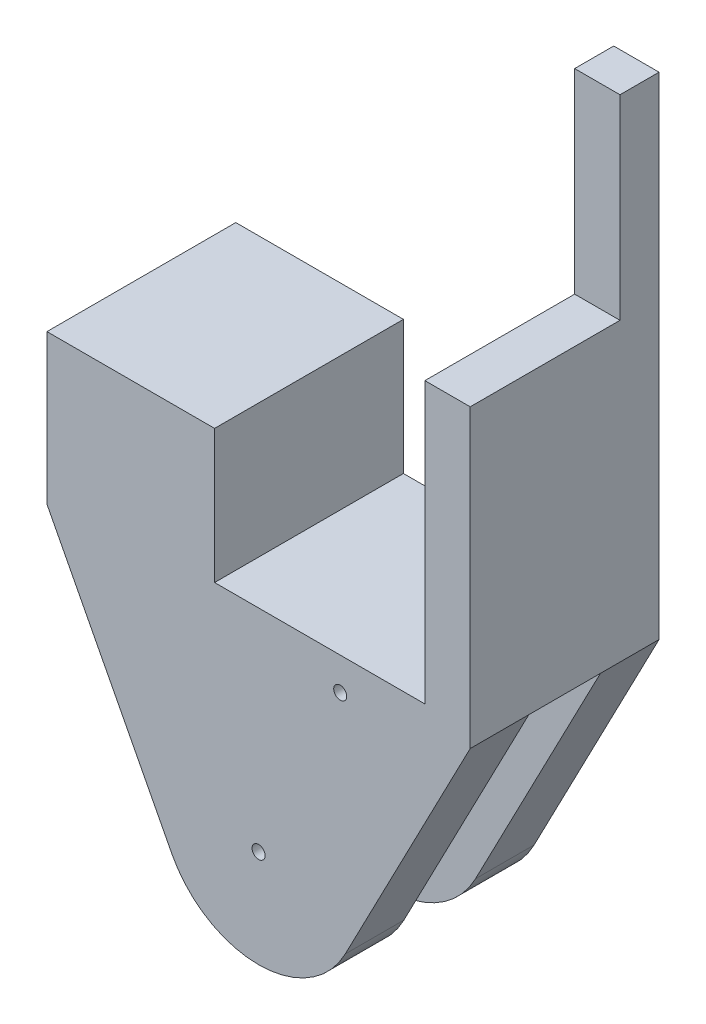
ISO-10303-21;
HEADER;
FILE_DESCRIPTION(('STEP AP214'),'2;1');
FILE_NAME('part.step','',(''),(''),'','','');
FILE_SCHEMA(('AUTOMOTIVE_DESIGN { 1 0 10303 214 1 1 1 1 }'));
ENDSEC;
DATA;
#1=APPLICATION_CONTEXT('core data for automotive mechanical design processes');
#2=APPLICATION_PROTOCOL_DEFINITION('international standard','automotive_design',2000,#1);
#3=PRODUCT_CONTEXT('',#1,'mechanical');
#4=PRODUCT('Part','Part','',(#3));
#5=PRODUCT_RELATED_PRODUCT_CATEGORY('part','',(#4));
#6=PRODUCT_DEFINITION_FORMATION('','',#4);
#7=PRODUCT_DEFINITION_CONTEXT('part definition',#1,'design');
#8=PRODUCT_DEFINITION('design','',#6,#7);
#9=PRODUCT_DEFINITION_SHAPE('','',#8);
#10=(LENGTH_UNIT() NAMED_UNIT(*) SI_UNIT(.MILLI.,.METRE.));
#11=(NAMED_UNIT(*) PLANE_ANGLE_UNIT() SI_UNIT($,.RADIAN.));
#12=(NAMED_UNIT(*) SI_UNIT($,.STERADIAN.) SOLID_ANGLE_UNIT());
#13=UNCERTAINTY_MEASURE_WITH_UNIT(LENGTH_MEASURE(1.E-05),#10,'distance_accuracy_value','');
#14=(GEOMETRIC_REPRESENTATION_CONTEXT(3) GLOBAL_UNCERTAINTY_ASSIGNED_CONTEXT((#13)) GLOBAL_UNIT_ASSIGNED_CONTEXT((#10,
#11,#12)) REPRESENTATION_CONTEXT('',''));
#15=CARTESIAN_POINT('',(0.,0.,0.));
#16=DIRECTION('',(0.,0.,1.));
#17=DIRECTION('',(1.,0.,0.));
#18=AXIS2_PLACEMENT_3D('',#15,#16,#17);
#19=CARTESIAN_POINT('',(-32.5,32.4499999999811,39.9999999999906));
#20=DIRECTION('',(0.,-1.,-7.37656463689618E-13));
#21=DIRECTION('',(-1.,0.,0.));
#22=AXIS2_PLACEMENT_3D('',#19,#20,#21);
#23=PLANE('',#22);
#24=DIRECTION('',(0.,7.37656463689618E-13,-1.));
#25=VECTOR('',#24,1.);
#26=CARTESIAN_POINT('',(-6.75628302707423,32.4499999999892,28.9999999999906));
#27=LINE('',#26,#25);
#28=CARTESIAN_POINT('',(-6.75628302707423,32.4499999999892,28.9999999999906));
#29=VERTEX_POINT('',#28);
#30=CARTESIAN_POINT('',(-6.75628302707423,32.4500000000106,-9.45077349712165E-12));
#31=VERTEX_POINT('',#30);
#32=EDGE_CURVE('E338',#29,#31,#27,.T.);
#33=ORIENTED_EDGE('',*,*,#32,.F.);
#34=DIRECTION('',(1.,0.,0.));
#35=VECTOR('',#34,1.);
#36=CARTESIAN_POINT('',(-32.5,32.4499999999892,28.9999999999906));
#37=LINE('',#36,#35);
#38=CARTESIAN_POINT('',(25.5375870433585,32.4499999999892,28.9999999999906));
#39=VERTEX_POINT('',#38);
#40=EDGE_CURVE('E255',#29,#39,#37,.T.);
#41=ORIENTED_EDGE('',*,*,#40,.T.);
#42=DIRECTION('',(0.,-7.37656463689618E-13,1.));
#43=VECTOR('',#42,1.);
#44=CARTESIAN_POINT('',(25.5375870433585,32.4499999999892,28.9999999999906));
#45=LINE('',#44,#43);
#46=CARTESIAN_POINT('',(25.5375870433585,32.4500000000106,-9.45077349712165E-12));
#47=VERTEX_POINT('',#46);
#48=EDGE_CURVE('E212',#47,#39,#45,.T.);
#49=ORIENTED_EDGE('',*,*,#48,.F.);
#50=DIRECTION('',(-1.,0.,0.));
#51=VECTOR('',#50,1.);
#52=CARTESIAN_POINT('',(-32.5,32.4500000000106,-9.45077349712165E-12));
#53=LINE('',#52,#51);
#54=EDGE_CURVE('E95',#47,#31,#53,.T.);
#55=ORIENTED_EDGE('',*,*,#54,.T.);
#56=EDGE_LOOP('',(#33,#41,#49,#55));
#57=FACE_BOUND('',#56,.T.);
#58=ADVANCED_FACE('F73',(#57),#23,.F.);
#59=CARTESIAN_POINT('',(0.,1.35134958778593E-11,-4.00000000003339));
#60=DIRECTION('',(0.,-7.37656463689618E-13,1.));
#61=DIRECTION('',(0.,-1.,-7.37656463689618E-13));
#62=AXIS2_PLACEMENT_3D('',#59,#60,#61);
#63=CYLINDRICAL_SURFACE('',#62,0.999999999999998);
#64=CARTESIAN_POINT('',(0.,3.92394450265954E-12,8.99999999996662));
#65=DIRECTION('',(0.,7.37656463689618E-13,-1.));
#66=DIRECTION('',(0.,1.,7.37656463689618E-13));
#67=AXIS2_PLACEMENT_3D('',#64,#65,#66);
#68=CIRCLE('',#67,0.999999999999998);
#69=CARTESIAN_POINT('',(0.,1.00000000000392,8.99999999996736));
#70=VERTEX_POINT('',#69);
#71=EDGE_CURVE('E303',#70,#70,#68,.T.);
#72=ORIENTED_EDGE('',*,*,#71,.F.);
#73=EDGE_LOOP('',(#72));
#74=FACE_BOUND('',#73,.T.);
#75=CARTESIAN_POINT('',(0.,8.75341465977897E-12,2.44999999996662));
#76=DIRECTION('',(0.,7.37656463689618E-13,-1.));
#77=DIRECTION('',(0.,1.,7.37656463689618E-13));
#78=AXIS2_PLACEMENT_3D('',#75,#76,#77);
#79=CIRCLE('',#78,0.999999999999998);
#80=CARTESIAN_POINT('',(0.,1.00000000000875,2.44999999996736));
#81=VERTEX_POINT('',#80);
#82=EDGE_CURVE('E280',#81,#81,#79,.F.);
#83=ORIENTED_EDGE('',*,*,#82,.F.);
#84=EDGE_LOOP('',(#83));
#85=FACE_BOUND('',#84,.T.);
#86=ADVANCED_FACE('F418',(#74,#85),#63,.F.);
#87=CARTESIAN_POINT('',(-32.5,30.0000000000039,8.99999999998875));
#88=DIRECTION('',(0.,7.37656463689618E-13,-1.));
#89=DIRECTION('',(0.,1.,7.37656463689618E-13));
#90=AXIS2_PLACEMENT_3D('',#87,#88,#89);
#91=PLANE('',#90);
#92=CARTESIAN_POINT('',(12.5375870433585,27.4500000000039,8.99999999998687));
#93=DIRECTION('',(0.,7.37656463689618E-13,-1.));
#94=DIRECTION('',(0.,1.,7.37656463689618E-13));
#95=AXIS2_PLACEMENT_3D('',#92,#93,#94);
#96=CIRCLE('',#95,0.999999999999998);
#97=CARTESIAN_POINT('',(12.5375870433585,28.4500000000039,8.9999999999876));
#98=VERTEX_POINT('',#97);
#99=EDGE_CURVE('E321',#98,#98,#96,.T.);
#100=ORIENTED_EDGE('',*,*,#99,.T.);
#101=EDGE_LOOP('',(#100));
#102=FACE_BOUND('',#101,.T.);
#103=ORIENTED_EDGE('',*,*,#71,.T.);
#104=EDGE_LOOP('',(#103));
#105=FACE_BOUND('',#104,.T.);
#106=DIRECTION('',(-0.461224027802595,0.887283717971626,6.54510569688326E-13));
#107=VECTOR('',#106,1.);
#108=CARTESIAN_POINT('',(-32.5,30.0000000000039,8.99999999998875));
#109=LINE('',#108,#107);
#110=CARTESIAN_POINT('',(-13.3092557695744,-6.91836041703499,8.99999999996151));
#111=VERTEX_POINT('',#110);
#112=CARTESIAN_POINT('',(-32.5,30.0000000000039,8.99999999998875));
#113=VERTEX_POINT('',#112);
#114=EDGE_CURVE('E289',#111,#113,#109,.T.);
#115=ORIENTED_EDGE('',*,*,#114,.F.);
#116=CARTESIAN_POINT('',(0.,3.92394450265954E-12,8.99999999996662));
#117=DIRECTION('',(0.,7.37656463689618E-13,-1.));
#118=DIRECTION('',(0.,1.,7.37656463689618E-13));
#119=AXIS2_PLACEMENT_3D('',#116,#117,#118);
#120=CIRCLE('',#119,15.);
#121=CARTESIAN_POINT('',(13.3092557695744,-6.91836041703499,8.99999999996151));
#122=VERTEX_POINT('',#121);
#123=EDGE_CURVE('E296',#122,#111,#120,.T.);
#124=ORIENTED_EDGE('',*,*,#123,.F.);
#125=DIRECTION('',(0.461224027802595,0.887283717971626,6.54510569688326E-13));
#126=VECTOR('',#125,1.);
#127=CARTESIAN_POINT('',(18.6727057515408,3.39962293657917,8.99999999996913));
#128=LINE('',#127,#126);
#129=CARTESIAN_POINT('',(32.5,30.0000000000039,8.99999999998875));
#130=VERTEX_POINT('',#129);
#131=EDGE_CURVE('E300',#122,#130,#128,.T.);
#132=ORIENTED_EDGE('',*,*,#131,.T.);
#133=DIRECTION('',(1.,0.,0.));
#134=VECTOR('',#133,1.);
#135=CARTESIAN_POINT('',(-32.5,30.0000000000039,8.99999999998875));
#136=LINE('',#135,#134);
#137=EDGE_CURVE('E308',#113,#130,#136,.T.);
#138=ORIENTED_EDGE('',*,*,#137,.F.);
#139=EDGE_LOOP('',(#115,#124,#132,#138));
#140=FACE_BOUND('',#139,.T.);
#141=ADVANCED_FACE('F75',(#102,#105,#140),#91,.F.);
#142=CARTESIAN_POINT('',(-32.5,30.0000000000106,-1.12548859121375E-11));
#143=DIRECTION('',(0.,7.37656463689618E-13,-1.));
#144=DIRECTION('',(0.,1.,7.37656463689618E-13));
#145=AXIS2_PLACEMENT_3D('',#142,#143,#144);
#146=PLANE('',#145);
#147=CARTESIAN_POINT('',(12.5375870433585,27.4500000000106,-1.31353261600964E-11));
#148=DIRECTION('',(0.,7.37656463689618E-13,-1.));
#149=DIRECTION('',(0.,1.,7.37656463689618E-13));
#150=AXIS2_PLACEMENT_3D('',#147,#148,#149);
#151=CIRCLE('',#150,3.);
#152=CARTESIAN_POINT('',(12.5375870433585,30.4500000000106,-1.09223567690275E-11));
#153=VERTEX_POINT('',#152);
#154=EDGE_CURVE('E334',#153,#153,#151,.T.);
#155=ORIENTED_EDGE('',*,*,#154,.F.);
#156=EDGE_LOOP('',(#155));
#157=FACE_BOUND('',#156,.T.);
#158=CARTESIAN_POINT('',(0.,1.05609965217468E-11,-3.33830185716977E-11));
#159=DIRECTION('',(0.,7.37656463689618E-13,-1.));
#160=DIRECTION('',(0.,1.,7.37656463689618E-13));
#161=AXIS2_PLACEMENT_3D('',#158,#159,#160);
#162=CIRCLE('',#161,3.);
#163=CARTESIAN_POINT('',(0.,3.00000000001056,-3.11700491806288E-11));
#164=VERTEX_POINT('',#163);
#165=EDGE_CURVE('E276',#164,#164,#162,.T.);
#166=ORIENTED_EDGE('',*,*,#165,.F.);
#167=EDGE_LOOP('',(#166));
#168=FACE_BOUND('',#167,.T.);
#169=CARTESIAN_POINT('',(0.,1.05609965217468E-11,-3.33830185716977E-11));
#170=DIRECTION('',(0.,7.37656463689618E-13,-1.));
#171=DIRECTION('',(0.,1.,7.37656463689618E-13));
#172=AXIS2_PLACEMENT_3D('',#169,#170,#171);
#173=CIRCLE('',#172,15.);
#174=CARTESIAN_POINT('',(13.3092557695744,-6.91836041702835,-3.84900444849734E-11));
#175=VERTEX_POINT('',#174);
#176=CARTESIAN_POINT('',(-13.3092557695744,-6.91836041702835,-3.84900444849734E-11));
#177=VERTEX_POINT('',#176);
#178=EDGE_CURVE('E294',#175,#177,#173,.T.);
#179=ORIENTED_EDGE('',*,*,#178,.T.);
#180=DIRECTION('',(-0.461224027802595,0.887283717971626,6.54510569688326E-13));
#181=VECTOR('',#180,1.);
#182=CARTESIAN_POINT('',(-32.5,30.0000000000106,-1.12548859121375E-11));
#183=LINE('',#182,#181);
#184=CARTESIAN_POINT('',(-32.5,30.0000000000106,-1.12548859121375E-11));
#185=VERTEX_POINT('',#184);
#186=EDGE_CURVE('E286',#177,#185,#183,.T.);
#187=ORIENTED_EDGE('',*,*,#186,.T.);
#188=DIRECTION('',(0.,-1.,-7.37656463689618E-13));
#189=VECTOR('',#188,1.);
#190=CARTESIAN_POINT('',(-32.5,32.4500000000106,-9.45077349712165E-12));
#191=LINE('',#190,#189);
#192=CARTESIAN_POINT('',(-32.5,52.9500000000106,5.67601521339611E-12));
#193=VERTEX_POINT('',#192);
#194=EDGE_CURVE('E260',#193,#185,#191,.T.);
#195=ORIENTED_EDGE('',*,*,#194,.F.);
#196=DIRECTION('',(-1.,0.,0.));
#197=VECTOR('',#196,1.);
#198=CARTESIAN_POINT('',(-6.75628302707423,52.9500000000106,5.67601521339611E-12));
#199=LINE('',#198,#197);
#200=CARTESIAN_POINT('',(-6.75628302707423,52.9500000000106,5.67601521339611E-12));
#201=VERTEX_POINT('',#200);
#202=EDGE_CURVE('E344',#201,#193,#199,.T.);
#203=ORIENTED_EDGE('',*,*,#202,.F.);
#204=DIRECTION('',(0.,-1.,-7.37656463689618E-13));
#205=VECTOR('',#204,1.);
#206=CARTESIAN_POINT('',(-6.75628302707423,52.9500000000106,5.67601521339611E-12));
#207=LINE('',#206,#205);
#208=EDGE_CURVE('E214',#201,#31,#207,.T.);
#209=ORIENTED_EDGE('',*,*,#208,.T.);
#210=ORIENTED_EDGE('',*,*,#54,.F.);
#211=DIRECTION('',(0.,-1.,-7.37656463689618E-13));
#212=VECTOR('',#211,1.);
#213=CARTESIAN_POINT('',(25.5375870433585,105.450000000011,4.44019820911024E-11));
#214=LINE('',#213,#212);
#215=CARTESIAN_POINT('',(25.5375870433585,105.450000000011,4.44019820911024E-11));
#216=VERTEX_POINT('',#215);
#217=EDGE_CURVE('E206',#216,#47,#214,.T.);
#218=ORIENTED_EDGE('',*,*,#217,.F.);
#219=DIRECTION('',(-1.,0.,0.));
#220=VECTOR('',#219,1.);
#221=CARTESIAN_POINT('',(32.5,105.450000000011,4.44019820911024E-11));
#222=LINE('',#221,#220);
#223=CARTESIAN_POINT('',(32.5,105.450000000011,4.44019820911024E-11));
#224=VERTEX_POINT('',#223);
#225=EDGE_CURVE('E202',#224,#216,#222,.T.);
#226=ORIENTED_EDGE('',*,*,#225,.F.);
#227=DIRECTION('',(0.,-1.,-7.37656463689618E-13));
#228=VECTOR('',#227,1.);
#229=CARTESIAN_POINT('',(32.5,32.4500000000106,-9.45077349712165E-12));
#230=LINE('',#229,#228);
#231=CARTESIAN_POINT('',(32.5,30.0000000000106,-1.12548859121375E-11));
#232=VERTEX_POINT('',#231);
#233=EDGE_CURVE('E268',#224,#232,#230,.T.);
#234=ORIENTED_EDGE('',*,*,#233,.T.);
#235=DIRECTION('',(0.461224027802595,0.887283717971626,6.54510569688326E-13));
#236=VECTOR('',#235,1.);
#237=CARTESIAN_POINT('',(18.6727057515408,3.39962293658581,-3.08780778723872E-11));
#238=LINE('',#237,#236);
#239=EDGE_CURVE('E298',#175,#232,#238,.T.);
#240=ORIENTED_EDGE('',*,*,#239,.F.);
#241=EDGE_LOOP('',(#179,#187,#195,#203,#209,#210,#218,#226,#234,#240));
#242=FACE_BOUND('',#241,.T.);
#243=ADVANCED_FACE('F363',(#157,#168,#242),#146,.T.);
#244=CARTESIAN_POINT('',(0.257060092246776,-32.027634891401,-4.00000000005701));
#245=DIRECTION('',(-0.887283717971626,0.461224027802595,3.40224885317544E-13));
#246=DIRECTION('',(0.461224027802595,0.887283717971626,6.54510569688325E-13));
#247=AXIS2_PLACEMENT_3D('',#244,#245,#246);
#248=PLANE('',#247);
#249=DIRECTION('',(0.,-7.37656463689618E-13,1.));
#250=VECTOR('',#249,1.);
#251=CARTESIAN_POINT('',(13.3092557695744,-6.9183604170254,-4.00000000003849));
#252=LINE('',#251,#250);
#253=EDGE_CURVE('E291',#175,#122,#252,.T.);
#254=ORIENTED_EDGE('',*,*,#253,.F.);
#255=ORIENTED_EDGE('',*,*,#239,.T.);
#256=DIRECTION('',(0.,7.37656463689618E-13,-1.));
#257=VECTOR('',#256,1.);
#258=CARTESIAN_POINT('',(32.5,29.9999999999811,39.9999999999887));
#259=LINE('',#258,#257);
#260=EDGE_CURVE('E81',#130,#232,#259,.T.);
#261=ORIENTED_EDGE('',*,*,#260,.F.);
#262=ORIENTED_EDGE('',*,*,#131,.F.);
#263=EDGE_LOOP('',(#254,#255,#261,#262));
#264=FACE_BOUND('',#263,.T.);
#265=ADVANCED_FACE('F415',(#264),#248,.F.);
#266=CARTESIAN_POINT('',(0.,1.35134958778593E-11,-4.00000000003339));
#267=DIRECTION('',(0.,-7.37656463689618E-13,1.));
#268=DIRECTION('',(0.,-1.,-7.37656463689618E-13));
#269=AXIS2_PLACEMENT_3D('',#266,#267,#268);
#270=CYLINDRICAL_SURFACE('',#269,15.);
#271=ORIENTED_EDGE('',*,*,#123,.T.);
#272=DIRECTION('',(0.,-7.37656463689618E-13,1.));
#273=VECTOR('',#272,1.);
#274=CARTESIAN_POINT('',(-13.3092557695744,-6.9183604170254,-4.00000000003849));
#275=LINE('',#274,#273);
#276=EDGE_CURVE('E283',#177,#111,#275,.T.);
#277=ORIENTED_EDGE('',*,*,#276,.F.);
#278=ORIENTED_EDGE('',*,*,#178,.F.);
#279=ORIENTED_EDGE('',*,*,#253,.T.);
#280=EDGE_LOOP('',(#271,#277,#278,#279));
#281=FACE_BOUND('',#280,.T.);
#282=ADVANCED_FACE('F412',(#281),#270,.T.);
#283=CARTESIAN_POINT('',(-14.0843543407059,-5.4272578279763,-4.00000000003739));
#284=DIRECTION('',(-0.887283717971626,-0.461224027802595,-3.40224885317544E-13));
#285=DIRECTION('',(-0.461224027802595,0.887283717971626,6.54510569688325E-13));
#286=AXIS2_PLACEMENT_3D('',#283,#284,#285);
#287=PLANE('',#286);
#288=ORIENTED_EDGE('',*,*,#114,.T.);
#289=DIRECTION('',(0.,7.37656463689618E-13,-1.));
#290=VECTOR('',#289,1.);
#291=CARTESIAN_POINT('',(-32.5,29.9999999999811,39.9999999999888));
#292=LINE('',#291,#290);
#293=EDGE_CURVE('E306',#113,#185,#292,.T.);
#294=ORIENTED_EDGE('',*,*,#293,.T.);
#295=ORIENTED_EDGE('',*,*,#186,.F.);
#296=ORIENTED_EDGE('',*,*,#276,.T.);
#297=EDGE_LOOP('',(#288,#294,#295,#296));
#298=FACE_BOUND('',#297,.T.);
#299=ADVANCED_FACE('F406',(#298),#287,.T.);
#300=CARTESIAN_POINT('',(0.,8.75341465977897E-12,2.44999999996662));
#301=DIRECTION('',(0.,7.37656463689618E-13,-1.));
#302=DIRECTION('',(0.,1.,7.37656463689618E-13));
#303=AXIS2_PLACEMENT_3D('',#300,#301,#302);
#304=PLANE('',#303);
#305=CARTESIAN_POINT('',(0.,8.75341465977897E-12,2.44999999996662));
#306=DIRECTION('',(0.,7.37656463689618E-13,-1.));
#307=DIRECTION('',(0.,1.,7.37656463689618E-13));
#308=AXIS2_PLACEMENT_3D('',#305,#306,#307);
#309=CIRCLE('',#308,3.);
#310=CARTESIAN_POINT('',(0.,3.00000000000875,2.44999999996883));
#311=VERTEX_POINT('',#310);
#312=EDGE_CURVE('E277',#311,#311,#309,.T.);
#313=ORIENTED_EDGE('',*,*,#312,.T.);
#314=EDGE_LOOP('',(#313));
#315=FACE_BOUND('',#314,.T.);
#316=ORIENTED_EDGE('',*,*,#82,.T.);
#317=EDGE_LOOP('',(#316));
#318=FACE_BOUND('',#317,.T.);
#319=ADVANCED_FACE('F447',(#315,#318),#304,.T.);
#320=CARTESIAN_POINT('',(0.,8.75341465977897E-12,2.44999999996662));
#321=DIRECTION('',(0.,7.37656463689618E-13,-1.));
#322=DIRECTION('',(0.,1.,7.37656463689618E-13));
#323=AXIS2_PLACEMENT_3D('',#320,#321,#322);
#324=CYLINDRICAL_SURFACE('',#323,3.);
#325=ORIENTED_EDGE('',*,*,#312,.F.);
#326=EDGE_LOOP('',(#325));
#327=FACE_BOUND('',#326,.T.);
#328=ORIENTED_EDGE('',*,*,#165,.T.);
#329=EDGE_LOOP('',(#328));
#330=FACE_BOUND('',#329,.T.);
#331=ADVANCED_FACE('F446',(#327,#330),#324,.F.);
#332=CARTESIAN_POINT('',(-32.5,32.4499999999892,28.9999999999906));
#333=DIRECTION('',(1.,0.,0.));
#334=DIRECTION('',(0.,7.37656463689618E-13,-1.));
#335=AXIS2_PLACEMENT_3D('',#332,#333,#334);
#336=PLANE('',#335);
#337=ORIENTED_EDGE('',*,*,#293,.F.);
#338=DIRECTION('',(0.,-7.37656463689618E-13,1.));
#339=VECTOR('',#338,1.);
#340=CARTESIAN_POINT('',(-32.5,29.9999999999892,28.9999999999887));
#341=LINE('',#340,#339);
#342=CARTESIAN_POINT('',(-32.5,29.9999999999958,19.9999999999888));
#343=VERTEX_POINT('',#342);
#344=EDGE_CURVE('E250',#113,#343,#341,.T.);
#345=ORIENTED_EDGE('',*,*,#344,.T.);
#346=DIRECTION('',(0.,7.37656463689618E-13,-1.));
#347=VECTOR('',#346,1.);
#348=CARTESIAN_POINT('',(-32.5,29.9999999999811,39.9999999999888));
#349=LINE('',#348,#347);
#350=CARTESIAN_POINT('',(-32.5,29.9999999999892,28.9999999999887));
#351=VERTEX_POINT('',#350);
#352=EDGE_CURVE('E248',#351,#343,#349,.T.);
#353=ORIENTED_EDGE('',*,*,#352,.F.);
#354=DIRECTION('',(0.,-1.,-7.37656463689618E-13));
#355=VECTOR('',#354,1.);
#356=CARTESIAN_POINT('',(-32.5,32.4499999999892,28.9999999999906));
#357=LINE('',#356,#355);
#358=CARTESIAN_POINT('',(-32.5,52.9499999999892,29.0000000000057));
#359=VERTEX_POINT('',#358);
#360=EDGE_CURVE('E273',#359,#351,#357,.T.);
#361=ORIENTED_EDGE('',*,*,#360,.F.);
#362=DIRECTION('',(0.,-7.37656463689618E-13,1.));
#363=VECTOR('',#362,1.);
#364=CARTESIAN_POINT('',(-32.5,52.9499999999892,29.0000000000057));
#365=LINE('',#364,#363);
#366=EDGE_CURVE('E347',#193,#359,#365,.T.);
#367=ORIENTED_EDGE('',*,*,#366,.F.);
#368=ORIENTED_EDGE('',*,*,#194,.T.);
#369=EDGE_LOOP('',(#337,#345,#353,#361,#367,#368));
#370=FACE_BOUND('',#369,.T.);
#371=ADVANCED_FACE('F402',(#370),#336,.F.);
#372=CARTESIAN_POINT('',(-32.5,32.4499999999892,28.9999999999906));
#373=DIRECTION('',(0.,7.37656463689618E-13,-1.));
#374=DIRECTION('',(0.,1.,7.37656463689618E-13));
#375=AXIS2_PLACEMENT_3D('',#372,#373,#374);
#376=PLANE('',#375);
#377=CARTESIAN_POINT('',(12.5375870433585,27.4499999999892,28.9999999999869));
#378=DIRECTION('',(0.,7.37656463689618E-13,-1.));
#379=DIRECTION('',(0.,1.,7.37656463689618E-13));
#380=AXIS2_PLACEMENT_3D('',#377,#378,#379);
#381=CIRCLE('',#380,0.999999999999998);
#382=CARTESIAN_POINT('',(12.5375870433585,28.4499999999892,28.9999999999876));
#383=VERTEX_POINT('',#382);
#384=EDGE_CURVE('E316',#383,#383,#381,.T.);
#385=ORIENTED_EDGE('',*,*,#384,.T.);
#386=EDGE_LOOP('',(#385));
#387=FACE_BOUND('',#386,.T.);
#388=DIRECTION('',(0.,-1.,-7.37656463689618E-13));
#389=VECTOR('',#388,1.);
#390=CARTESIAN_POINT('',(32.5,32.4499999999892,28.9999999999906));
#391=LINE('',#390,#389);
#392=CARTESIAN_POINT('',(32.5,75.4499999999892,29.0000000000444));
#393=VERTEX_POINT('',#392);
#394=CARTESIAN_POINT('',(32.5,29.9999999999892,28.9999999999887));
#395=VERTEX_POINT('',#394);
#396=EDGE_CURVE('E271',#393,#395,#391,.T.);
#397=ORIENTED_EDGE('',*,*,#396,.F.);
#398=DIRECTION('',(-1.,0.,0.));
#399=VECTOR('',#398,1.);
#400=CARTESIAN_POINT('',(35.5375870433585,75.4499999999892,29.0000000000444));
#401=LINE('',#400,#399);
#402=CARTESIAN_POINT('',(25.5375870433585,75.4499999999892,29.0000000000444));
#403=VERTEX_POINT('',#402);
#404=EDGE_CURVE('E372',#393,#403,#401,.T.);
#405=ORIENTED_EDGE('',*,*,#404,.T.);
#406=DIRECTION('',(0.,-1.,-7.37656463689618E-13));
#407=VECTOR('',#406,1.);
#408=CARTESIAN_POINT('',(25.5375870433585,105.449999999989,29.0000000000444));
#409=LINE('',#408,#407);
#410=EDGE_CURVE('E204',#403,#39,#409,.T.);
#411=ORIENTED_EDGE('',*,*,#410,.T.);
#412=ORIENTED_EDGE('',*,*,#40,.F.);
#413=DIRECTION('',(0.,-1.,-7.37656463689618E-13));
#414=VECTOR('',#413,1.);
#415=CARTESIAN_POINT('',(-6.75628302707423,52.9499999999892,29.0000000000057));
#416=LINE('',#415,#414);
#417=CARTESIAN_POINT('',(-6.75628302707423,52.9499999999892,29.0000000000057));
#418=VERTEX_POINT('',#417);
#419=EDGE_CURVE('E352',#418,#29,#416,.T.);
#420=ORIENTED_EDGE('',*,*,#419,.F.);
#421=DIRECTION('',(1.,0.,0.));
#422=VECTOR('',#421,1.);
#423=CARTESIAN_POINT('',(-6.75628302707423,52.9499999999892,29.0000000000057));
#424=LINE('',#423,#422);
#425=EDGE_CURVE('E350',#359,#418,#424,.T.);
#426=ORIENTED_EDGE('',*,*,#425,.F.);
#427=ORIENTED_EDGE('',*,*,#360,.T.);
#428=DIRECTION('',(-0.461224027802595,0.887283717971626,6.54510569688326E-13));
#429=VECTOR('',#428,1.);
#430=CARTESIAN_POINT('',(-32.5,29.9999999999892,28.9999999999887));
#431=LINE('',#430,#429);
#432=CARTESIAN_POINT('',(-13.3092557695744,-6.91836041704974,28.9999999999615));
#433=VERTEX_POINT('',#432);
#434=EDGE_CURVE('E227',#433,#351,#431,.T.);
#435=ORIENTED_EDGE('',*,*,#434,.F.);
#436=CARTESIAN_POINT('',(0.,-1.08281439370472E-11,28.9999999999666));
#437=DIRECTION('',(0.,7.37656463689618E-13,-1.));
#438=DIRECTION('',(0.,1.,7.37656463689618E-13));
#439=AXIS2_PLACEMENT_3D('',#436,#437,#438);
#440=CIRCLE('',#439,15.);
#441=CARTESIAN_POINT('',(13.3092557695744,-6.91836041704974,28.9999999999615));
#442=VERTEX_POINT('',#441);
#443=EDGE_CURVE('E235',#442,#433,#440,.T.);
#444=ORIENTED_EDGE('',*,*,#443,.F.);
#445=DIRECTION('',(0.461224027802595,0.887283717971626,6.54510569688326E-13));
#446=VECTOR('',#445,1.);
#447=CARTESIAN_POINT('',(18.6727057515408,3.39962293656441,28.9999999999691));
#448=LINE('',#447,#446);
#449=EDGE_CURVE('E239',#442,#395,#448,.T.);
#450=ORIENTED_EDGE('',*,*,#449,.T.);
#451=EDGE_LOOP('',(#397,#405,#411,#412,#420,#426,#427,#435,#444,#450));
#452=FACE_BOUND('',#451,.T.);
#453=CARTESIAN_POINT('',(0.,-1.08281439370472E-11,28.9999999999666));
#454=DIRECTION('',(0.,7.37656463689618E-13,-1.));
#455=DIRECTION('',(0.,1.,7.37656463689618E-13));
#456=AXIS2_PLACEMENT_3D('',#453,#454,#455);
#457=CIRCLE('',#456,0.999999999999998);
#458=CARTESIAN_POINT('',(0.,0.99999999998917,28.9999999999674));
#459=VERTEX_POINT('',#458);
#460=EDGE_CURVE('E244',#459,#459,#457,.T.);
#461=ORIENTED_EDGE('',*,*,#460,.T.);
#462=EDGE_LOOP('',(#461));
#463=FACE_BOUND('',#462,.T.);
#464=ADVANCED_FACE('F367',(#387,#452,#463),#376,.F.);
#465=CARTESIAN_POINT('',(32.5,32.4499999999892,28.9999999999906));
#466=DIRECTION('',(-1.,0.,0.));
#467=DIRECTION('',(0.,1.,7.37656463689618E-13));
#468=AXIS2_PLACEMENT_3D('',#465,#466,#467);
#469=PLANE('',#468);
#470=DIRECTION('',(0.,-1.,0.));
#471=VECTOR('',#470,1.);
#472=CARTESIAN_POINT('',(32.5,32.4499999999892,6.00000000004441));
#473=LINE('',#472,#471);
#474=CARTESIAN_POINT('',(32.5,105.450000000006,6.00000000004441));
#475=VERTEX_POINT('',#474);
#476=CARTESIAN_POINT('',(32.5,75.4499999999892,6.00000000004441));
#477=VERTEX_POINT('',#476);
#478=EDGE_CURVE('E87',#475,#477,#473,.T.);
#479=ORIENTED_EDGE('',*,*,#478,.T.);
#480=DIRECTION('',(0.,0.,1.));
#481=VECTOR('',#480,1.);
#482=CARTESIAN_POINT('',(32.5,75.4499999999892,28.9999999999906));
#483=LINE('',#482,#481);
#484=EDGE_CURVE('E324',#477,#393,#483,.T.);
#485=ORIENTED_EDGE('',*,*,#484,.T.);
#486=ORIENTED_EDGE('',*,*,#396,.T.);
#487=DIRECTION('',(0.,7.37656463689618E-13,-1.));
#488=VECTOR('',#487,1.);
#489=CARTESIAN_POINT('',(32.5,29.9999999999892,28.9999999999887));
#490=LINE('',#489,#488);
#491=CARTESIAN_POINT('',(32.5,29.9999999999958,19.9999999999888));
#492=VERTEX_POINT('',#491);
#493=EDGE_CURVE('E258',#395,#492,#490,.T.);
#494=ORIENTED_EDGE('',*,*,#493,.T.);
#495=EDGE_CURVE('E263',#492,#130,#490,.T.);
#496=ORIENTED_EDGE('',*,*,#495,.T.);
#497=ORIENTED_EDGE('',*,*,#260,.T.);
#498=ORIENTED_EDGE('',*,*,#233,.F.);
#499=DIRECTION('',(0.,7.37656463689618E-13,-1.));
#500=VECTOR('',#499,1.);
#501=CARTESIAN_POINT('',(32.5,105.449999999989,29.0000000000444));
#502=LINE('',#501,#500);
#503=EDGE_CURVE('E208',#475,#224,#502,.T.);
#504=ORIENTED_EDGE('',*,*,#503,.F.);
#505=EDGE_LOOP('',(#479,#485,#486,#494,#496,#497,#498,#504));
#506=FACE_BOUND('',#505,.T.);
#507=ADVANCED_FACE('F359',(#506),#469,.F.);
#508=CARTESIAN_POINT('',(-32.5,29.9999999999811,39.9999999999888));
#509=DIRECTION('',(0.,-1.,-7.37656463689618E-13));
#510=DIRECTION('',(-1.,0.,0.));
#511=AXIS2_PLACEMENT_3D('',#508,#509,#510);
#512=PLANE('',#511);
#513=DIRECTION('',(1.,0.,0.));
#514=VECTOR('',#513,1.);
#515=CARTESIAN_POINT('',(-32.5,29.9999999999958,19.9999999999888));
#516=LINE('',#515,#514);
#517=EDGE_CURVE('E245',#343,#492,#516,.T.);
#518=ORIENTED_EDGE('',*,*,#517,.F.);
#519=ORIENTED_EDGE('',*,*,#344,.F.);
#520=ORIENTED_EDGE('',*,*,#137,.T.);
#521=ORIENTED_EDGE('',*,*,#495,.F.);
#522=EDGE_LOOP('',(#518,#519,#520,#521));
#523=FACE_BOUND('',#522,.T.);
#524=ADVANCED_FACE('F399',(#523),#512,.T.);
#525=CARTESIAN_POINT('',(0.,1.35134958778593E-11,-4.00000000003339));
#526=DIRECTION('',(0.,-7.37656463689618E-13,1.));
#527=DIRECTION('',(0.,-1.,-7.37656463689618E-13));
#528=AXIS2_PLACEMENT_3D('',#525,#526,#527);
#529=CYLINDRICAL_SURFACE('',#528,0.999999999999998);
#530=ORIENTED_EDGE('',*,*,#460,.F.);
#531=EDGE_LOOP('',(#530));
#532=FACE_BOUND('',#531,.T.);
#533=CARTESIAN_POINT('',(0.,-5.9986737799278E-12,22.4499999999666));
#534=DIRECTION('',(0.,7.37656463689618E-13,-1.));
#535=DIRECTION('',(-1.,0.,0.));
#536=AXIS2_PLACEMENT_3D('',#533,#534,#535);
#537=CIRCLE('',#536,0.999999999999998);
#538=CARTESIAN_POINT('',(-1.00000000000001,-5.9986737799278E-12,22.4499999999666));
#539=VERTEX_POINT('',#538);
#540=EDGE_CURVE('E221',#539,#539,#537,.F.);
#541=ORIENTED_EDGE('',*,*,#540,.F.);
#542=EDGE_LOOP('',(#541));
#543=FACE_BOUND('',#542,.T.);
#544=ADVANCED_FACE('F438',(#532,#543),#529,.F.);
#545=CARTESIAN_POINT('',(-32.5,29.9999999999958,19.9999999999888));
#546=DIRECTION('',(0.,7.37656463689618E-13,-1.));
#547=DIRECTION('',(-1.,0.,0.));
#548=AXIS2_PLACEMENT_3D('',#545,#546,#547);
#549=PLANE('',#548);
#550=CARTESIAN_POINT('',(12.5375870433585,27.4499999999958,19.9999999999869));
#551=DIRECTION('',(0.,7.37656463689618E-13,-1.));
#552=DIRECTION('',(-1.,0.,0.));
#553=AXIS2_PLACEMENT_3D('',#550,#551,#552);
#554=CIRCLE('',#553,0.999999999999998);
#555=CARTESIAN_POINT('',(11.5375870433585,27.4499999999958,19.9999999999869));
#556=VERTEX_POINT('',#555);
#557=EDGE_CURVE('E314',#556,#556,#554,.T.);
#558=ORIENTED_EDGE('',*,*,#557,.F.);
#559=EDGE_LOOP('',(#558));
#560=FACE_BOUND('',#559,.T.);
#561=CARTESIAN_POINT('',(0.,-4.19109191795997E-12,19.9999999999666));
#562=DIRECTION('',(0.,7.37656463689618E-13,-1.));
#563=DIRECTION('',(-1.,0.,0.));
#564=AXIS2_PLACEMENT_3D('',#561,#562,#563);
#565=CIRCLE('',#564,3.);
#566=CARTESIAN_POINT('',(-3.00000000000001,-4.19109191795997E-12,19.9999999999666));
#567=VERTEX_POINT('',#566);
#568=EDGE_CURVE('E217',#567,#567,#565,.T.);
#569=ORIENTED_EDGE('',*,*,#568,.F.);
#570=EDGE_LOOP('',(#569));
#571=FACE_BOUND('',#570,.T.);
#572=CARTESIAN_POINT('',(0.,-4.19109191795997E-12,19.9999999999666));
#573=DIRECTION('',(0.,7.37656463689618E-13,-1.));
#574=DIRECTION('',(-1.,0.,0.));
#575=AXIS2_PLACEMENT_3D('',#572,#573,#574);
#576=CIRCLE('',#575,15.);
#577=CARTESIAN_POINT('',(13.3092557695744,-6.9183604170431,19.9999999999615));
#578=VERTEX_POINT('',#577);
#579=CARTESIAN_POINT('',(-13.3092557695744,-6.91836041704311,19.9999999999615));
#580=VERTEX_POINT('',#579);
#581=EDGE_CURVE('E237',#578,#580,#576,.T.);
#582=ORIENTED_EDGE('',*,*,#581,.T.);
#583=DIRECTION('',(-0.461224027802595,0.887283717971626,6.54584424717438E-13));
#584=VECTOR('',#583,1.);
#585=CARTESIAN_POINT('',(-32.5,29.9999999999958,19.9999999999888));
#586=LINE('',#585,#584);
#587=EDGE_CURVE('E229',#580,#343,#586,.T.);
#588=ORIENTED_EDGE('',*,*,#587,.T.);
#589=ORIENTED_EDGE('',*,*,#517,.T.);
#590=DIRECTION('',(0.461224027802595,0.887283717971626,6.54436714659214E-13));
#591=VECTOR('',#590,1.);
#592=CARTESIAN_POINT('',(18.6727057515408,3.39962293657105,19.9999999999691));
#593=LINE('',#592,#591);
#594=EDGE_CURVE('E242',#578,#492,#593,.T.);
#595=ORIENTED_EDGE('',*,*,#594,.F.);
#596=EDGE_LOOP('',(#582,#588,#589,#595));
#597=FACE_BOUND('',#596,.T.);
#598=ADVANCED_FACE('F395',(#560,#571,#597),#549,.T.);
#599=CARTESIAN_POINT('',(0.257060092246776,-32.027634891401,-4.00000000005701));
#600=DIRECTION('',(-0.887283717971626,0.461224027802595,3.40224885317544E-13));
#601=DIRECTION('',(0.461224027802595,0.887283717971626,6.54510569688325E-13));
#602=AXIS2_PLACEMENT_3D('',#599,#600,#601);
#603=PLANE('',#602);
#604=ORIENTED_EDGE('',*,*,#594,.T.);
#605=ORIENTED_EDGE('',*,*,#493,.F.);
#606=ORIENTED_EDGE('',*,*,#449,.F.);
#607=DIRECTION('',(0.,-7.37656463689618E-13,1.));
#608=VECTOR('',#607,1.);
#609=CARTESIAN_POINT('',(13.3092557695744,-6.9183604170254,-4.00000000003849));
#610=LINE('',#609,#608);
#611=EDGE_CURVE('E232',#578,#442,#610,.T.);
#612=ORIENTED_EDGE('',*,*,#611,.F.);
#613=EDGE_LOOP('',(#604,#605,#606,#612));
#614=FACE_BOUND('',#613,.T.);
#615=ADVANCED_FACE('F381',(#614),#603,.F.);
#616=CARTESIAN_POINT('',(0.,1.35134958778593E-11,-4.00000000003339));
#617=DIRECTION('',(0.,-7.37656463689618E-13,1.));
#618=DIRECTION('',(0.,-1.,-7.37656463689618E-13));
#619=AXIS2_PLACEMENT_3D('',#616,#617,#618);
#620=CYLINDRICAL_SURFACE('',#619,15.);
#621=ORIENTED_EDGE('',*,*,#611,.T.);
#622=ORIENTED_EDGE('',*,*,#443,.T.);
#623=DIRECTION('',(0.,-7.37656463689618E-13,1.));
#624=VECTOR('',#623,1.);
#625=CARTESIAN_POINT('',(-13.3092557695744,-6.9183604170254,-4.00000000003849));
#626=LINE('',#625,#624);
#627=EDGE_CURVE('E224',#580,#433,#626,.T.);
#628=ORIENTED_EDGE('',*,*,#627,.F.);
#629=ORIENTED_EDGE('',*,*,#581,.F.);
#630=EDGE_LOOP('',(#621,#622,#628,#629));
#631=FACE_BOUND('',#630,.T.);
#632=ADVANCED_FACE('F388',(#631),#620,.T.);
#633=CARTESIAN_POINT('',(-14.0843543407059,-5.4272578279763,-4.00000000003739));
#634=DIRECTION('',(-0.887283717971626,-0.461224027802595,-3.40224885317544E-13));
#635=DIRECTION('',(-0.461224027802595,0.887283717971626,6.54510569688325E-13));
#636=AXIS2_PLACEMENT_3D('',#633,#634,#635);
#637=PLANE('',#636);
#638=ORIENTED_EDGE('',*,*,#627,.T.);
#639=ORIENTED_EDGE('',*,*,#434,.T.);
#640=ORIENTED_EDGE('',*,*,#352,.T.);
#641=ORIENTED_EDGE('',*,*,#587,.F.);
#642=EDGE_LOOP('',(#638,#639,#640,#641));
#643=FACE_BOUND('',#642,.T.);
#644=ADVANCED_FACE('F391',(#643),#637,.T.);
#645=CARTESIAN_POINT('',(0.,-5.9986737799278E-12,22.4499999999666));
#646=DIRECTION('',(0.,7.37656463689618E-13,-1.));
#647=DIRECTION('',(-1.,0.,0.));
#648=AXIS2_PLACEMENT_3D('',#645,#646,#647);
#649=PLANE('',#648);
#650=CARTESIAN_POINT('',(0.,-5.9986737799278E-12,22.4499999999666));
#651=DIRECTION('',(0.,7.37656463689618E-13,-1.));
#652=DIRECTION('',(-1.,0.,0.));
#653=AXIS2_PLACEMENT_3D('',#650,#651,#652);
#654=CIRCLE('',#653,3.);
#655=CARTESIAN_POINT('',(-3.00000000000001,-5.9986737799278E-12,22.4499999999666));
#656=VERTEX_POINT('',#655);
#657=EDGE_CURVE('E218',#656,#656,#654,.T.);
#658=ORIENTED_EDGE('',*,*,#657,.T.);
#659=EDGE_LOOP('',(#658));
#660=FACE_BOUND('',#659,.T.);
#661=ORIENTED_EDGE('',*,*,#540,.T.);
#662=EDGE_LOOP('',(#661));
#663=FACE_BOUND('',#662,.T.);
#664=ADVANCED_FACE('F526',(#660,#663),#649,.T.);
#665=CARTESIAN_POINT('',(0.,-5.9986737799278E-12,22.4499999999666));
#666=DIRECTION('',(0.,7.37656463689618E-13,-1.));
#667=DIRECTION('',(-1.,0.,0.));
#668=AXIS2_PLACEMENT_3D('',#665,#666,#667);
#669=CYLINDRICAL_SURFACE('',#668,3.);
#670=ORIENTED_EDGE('',*,*,#657,.F.);
#671=EDGE_LOOP('',(#670));
#672=FACE_BOUND('',#671,.T.);
#673=ORIENTED_EDGE('',*,*,#568,.T.);
#674=EDGE_LOOP('',(#673));
#675=FACE_BOUND('',#674,.T.);
#676=ADVANCED_FACE('F536',(#672,#675),#669,.F.);
#677=CARTESIAN_POINT('',(25.5375870433585,105.449999999989,29.0000000000444));
#678=DIRECTION('',(1.,0.,0.));
#679=DIRECTION('',(0.,-1.,-7.37656463689618E-13));
#680=AXIS2_PLACEMENT_3D('',#677,#678,#679);
#681=PLANE('',#680);
#682=ORIENTED_EDGE('',*,*,#410,.F.);
#683=DIRECTION('',(0.,0.,1.));
#684=VECTOR('',#683,1.);
#685=CARTESIAN_POINT('',(25.5375870433585,75.4499999999892,29.0000000000444));
#686=LINE('',#685,#684);
#687=CARTESIAN_POINT('',(25.5375870433585,75.4499999999892,6.00000000004441));
#688=VERTEX_POINT('',#687);
#689=EDGE_CURVE('E198',#688,#403,#686,.T.);
#690=ORIENTED_EDGE('',*,*,#689,.F.);
#691=DIRECTION('',(0.,-1.,0.));
#692=VECTOR('',#691,1.);
#693=CARTESIAN_POINT('',(25.5375870433585,105.449999999989,6.00000000004441));
#694=LINE('',#693,#692);
#695=CARTESIAN_POINT('',(25.5375870433585,105.449999999989,6.00000000004441));
#696=VERTEX_POINT('',#695);
#697=EDGE_CURVE('E187',#696,#688,#694,.T.);
#698=ORIENTED_EDGE('',*,*,#697,.F.);
#699=DIRECTION('',(0.,-7.37656463689618E-13,1.));
#700=VECTOR('',#699,1.);
#701=CARTESIAN_POINT('',(25.5375870433585,105.449999999989,29.0000000000444));
#702=LINE('',#701,#700);
#703=EDGE_CURVE('E197',#216,#696,#702,.T.);
#704=ORIENTED_EDGE('',*,*,#703,.F.);
#705=ORIENTED_EDGE('',*,*,#217,.T.);
#706=ORIENTED_EDGE('',*,*,#48,.T.);
#707=EDGE_LOOP('',(#682,#690,#698,#704,#705,#706));
#708=FACE_BOUND('',#707,.T.);
#709=ADVANCED_FACE('F195',(#708),#681,.F.);
#710=CARTESIAN_POINT('',(-32.5,105.449999999981,40.0000000000444));
#711=DIRECTION('',(0.,1.,7.37656463689618E-13));
#712=DIRECTION('',(1.,0.,0.));
#713=AXIS2_PLACEMENT_3D('',#710,#711,#712);
#714=PLANE('',#713);
#715=DIRECTION('',(-1.,0.,0.));
#716=VECTOR('',#715,1.);
#717=CARTESIAN_POINT('',(-32.5,105.450000000006,6.00000000004441));
#718=LINE('',#717,#716);
#719=EDGE_CURVE('E12',#475,#696,#718,.T.);
#720=ORIENTED_EDGE('',*,*,#719,.F.);
#721=ORIENTED_EDGE('',*,*,#503,.T.);
#722=ORIENTED_EDGE('',*,*,#225,.T.);
#723=ORIENTED_EDGE('',*,*,#703,.T.);
#724=EDGE_LOOP('',(#720,#721,#722,#723));
#725=FACE_BOUND('',#724,.T.);
#726=ADVANCED_FACE('F200',(#725),#714,.T.);
#727=CARTESIAN_POINT('',(-6.75628302707423,52.9499999999892,29.0000000000057));
#728=DIRECTION('',(-1.,0.,0.));
#729=DIRECTION('',(0.,1.,7.37656463689618E-13));
#730=AXIS2_PLACEMENT_3D('',#727,#728,#729);
#731=PLANE('',#730);
#732=ORIENTED_EDGE('',*,*,#32,.T.);
#733=ORIENTED_EDGE('',*,*,#208,.F.);
#734=DIRECTION('',(0.,7.37656463689618E-13,-1.));
#735=VECTOR('',#734,1.);
#736=CARTESIAN_POINT('',(-6.75628302707423,52.9499999999892,29.0000000000057));
#737=LINE('',#736,#735);
#738=EDGE_CURVE('E341',#418,#201,#737,.T.);
#739=ORIENTED_EDGE('',*,*,#738,.F.);
#740=ORIENTED_EDGE('',*,*,#419,.T.);
#741=EDGE_LOOP('',(#732,#733,#739,#740));
#742=FACE_BOUND('',#741,.T.);
#743=ADVANCED_FACE('F550',(#742),#731,.F.);
#744=CARTESIAN_POINT('',(-32.5,52.9499999999811,40.0000000000057));
#745=DIRECTION('',(0.,1.,7.37656463689618E-13));
#746=DIRECTION('',(1.,0.,0.));
#747=AXIS2_PLACEMENT_3D('',#744,#745,#746);
#748=PLANE('',#747);
#749=ORIENTED_EDGE('',*,*,#738,.T.);
#750=ORIENTED_EDGE('',*,*,#202,.T.);
#751=ORIENTED_EDGE('',*,*,#366,.T.);
#752=ORIENTED_EDGE('',*,*,#425,.T.);
#753=EDGE_LOOP('',(#749,#750,#751,#752));
#754=FACE_BOUND('',#753,.T.);
#755=ADVANCED_FACE('F555',(#754),#748,.T.);
#756=CARTESIAN_POINT('',(12.5375870433585,27.4500000000087,2.49999999998687));
#757=DIRECTION('',(0.,7.37656463689618E-13,-1.));
#758=DIRECTION('',(0.,1.,7.37656463689618E-13));
#759=AXIS2_PLACEMENT_3D('',#756,#757,#758);
#760=CYLINDRICAL_SURFACE('',#759,3.);
#761=CARTESIAN_POINT('',(12.5375870433585,27.4500000000087,2.49999999998687));
#762=DIRECTION('',(0.,7.37656463689618E-13,-1.));
#763=DIRECTION('',(0.,1.,7.37656463689618E-13));
#764=AXIS2_PLACEMENT_3D('',#761,#762,#763);
#765=CIRCLE('',#764,3.);
#766=CARTESIAN_POINT('',(12.5375870433585,30.4500000000087,2.49999999998908));
#767=VERTEX_POINT('',#766);
#768=EDGE_CURVE('E335',#767,#767,#765,.T.);
#769=ORIENTED_EDGE('',*,*,#768,.F.);
#770=EDGE_LOOP('',(#769));
#771=FACE_BOUND('',#770,.T.);
#772=ORIENTED_EDGE('',*,*,#154,.T.);
#773=EDGE_LOOP('',(#772));
#774=FACE_BOUND('',#773,.T.);
#775=ADVANCED_FACE('F567',(#771,#774),#760,.F.);
#776=CARTESIAN_POINT('',(12.5375870433585,27.4500000000087,2.49999999998687));
#777=DIRECTION('',(0.,7.37656463689618E-13,-1.));
#778=DIRECTION('',(0.,1.,7.37656463689618E-13));
#779=AXIS2_PLACEMENT_3D('',#776,#777,#778);
#780=PLANE('',#779);
#781=CARTESIAN_POINT('',(12.5375870433585,27.4500000000087,2.49999999998687));
#782=DIRECTION('',(0.,7.37656463689618E-13,-1.));
#783=DIRECTION('',(0.,1.,7.37656463689618E-13));
#784=AXIS2_PLACEMENT_3D('',#781,#782,#783);
#785=CIRCLE('',#784,0.999999999999998);
#786=CARTESIAN_POINT('',(12.5375870433585,28.4500000000087,2.4999999999876));
#787=VERTEX_POINT('',#786);
#788=EDGE_CURVE('E317',#787,#787,#785,.T.);
#789=ORIENTED_EDGE('',*,*,#788,.F.);
#790=EDGE_LOOP('',(#789));
#791=FACE_BOUND('',#790,.T.);
#792=ORIENTED_EDGE('',*,*,#768,.T.);
#793=EDGE_LOOP('',(#792));
#794=FACE_BOUND('',#793,.T.);
#795=ADVANCED_FACE('F577',(#791,#794),#780,.T.);
#796=CARTESIAN_POINT('',(12.5375870433585,27.4499999999847,34.9999999999869));
#797=DIRECTION('',(0.,7.37656463689618E-13,-1.));
#798=DIRECTION('',(0.,1.,7.37656463689618E-13));
#799=AXIS2_PLACEMENT_3D('',#796,#797,#798);
#800=CYLINDRICAL_SURFACE('',#799,0.999999999999998);
#801=ORIENTED_EDGE('',*,*,#557,.T.);
#802=EDGE_LOOP('',(#801));
#803=FACE_BOUND('',#802,.T.);
#804=ORIENTED_EDGE('',*,*,#384,.F.);
#805=EDGE_LOOP('',(#804));
#806=FACE_BOUND('',#805,.T.);
#807=ADVANCED_FACE('F587',(#803,#806),#800,.F.);
#808=ORIENTED_EDGE('',*,*,#788,.T.);
#809=EDGE_LOOP('',(#808));
#810=FACE_BOUND('',#809,.T.);
#811=ORIENTED_EDGE('',*,*,#99,.F.);
#812=EDGE_LOOP('',(#811));
#813=FACE_BOUND('',#812,.T.);
#814=ADVANCED_FACE('F598',(#810,#813),#800,.F.);
#815=CARTESIAN_POINT('',(35.5375870433585,75.4499999999892,29.0000000000444));
#816=DIRECTION('',(0.,-1.,0.));
#817=DIRECTION('',(0.,0.,-1.));
#818=AXIS2_PLACEMENT_3D('',#815,#816,#817);
#819=PLANE('',#818);
#820=DIRECTION('',(-1.,0.,0.));
#821=VECTOR('',#820,1.);
#822=CARTESIAN_POINT('',(35.5375870433585,75.4499999999892,6.00000000004441));
#823=LINE('',#822,#821);
#824=EDGE_CURVE('E374',#477,#688,#823,.T.);
#825=ORIENTED_EDGE('',*,*,#824,.T.);
#826=ORIENTED_EDGE('',*,*,#689,.T.);
#827=ORIENTED_EDGE('',*,*,#404,.F.);
#828=ORIENTED_EDGE('',*,*,#484,.F.);
#829=EDGE_LOOP('',(#825,#826,#827,#828));
#830=FACE_BOUND('',#829,.T.);
#831=ADVANCED_FACE('F378',(#830),#819,.F.);
#832=CARTESIAN_POINT('',(35.5375870433585,105.449999999989,6.00000000004441));
#833=DIRECTION('',(0.,0.,-1.));
#834=DIRECTION('',(0.,1.,0.));
#835=AXIS2_PLACEMENT_3D('',#832,#833,#834);
#836=PLANE('',#835);
#837=ORIENTED_EDGE('',*,*,#719,.T.);
#838=ORIENTED_EDGE('',*,*,#697,.T.);
#839=ORIENTED_EDGE('',*,*,#824,.F.);
#840=ORIENTED_EDGE('',*,*,#478,.F.);
#841=EDGE_LOOP('',(#837,#838,#839,#840));
#842=FACE_BOUND('',#841,.T.);
#843=ADVANCED_FACE('F186',(#842),#836,.F.);
#844=CLOSED_SHELL('',(#58,#86,#141,#243,#265,#282,#299,#319,#331,#371,#464,#507,#524,#544,#598,
#615,#632,#644,#664,#676,#709,#726,#743,#755,#775,#795,#807,#814,#831,#843));
#845=MANIFOLD_SOLID_BREP('B2',#844);
#846=ADVANCED_BREP_SHAPE_REPRESENTATION('',(#18,#845),#14);
#847=SHAPE_DEFINITION_REPRESENTATION(#9,#846);
ENDSEC;
END-ISO-10303-21;
